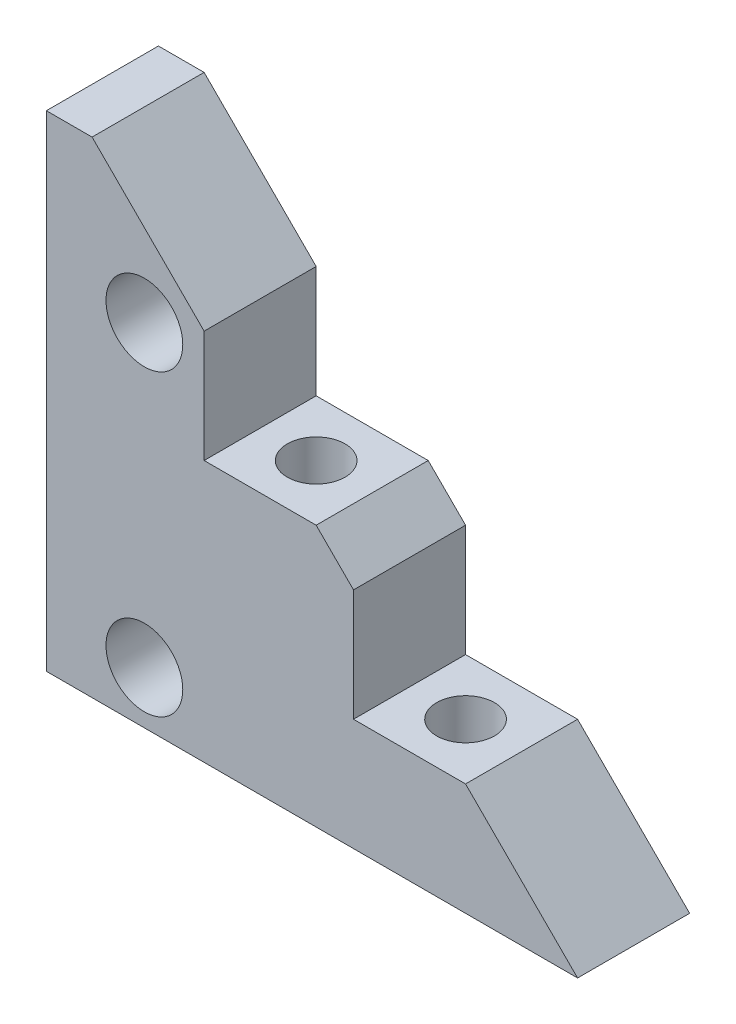
ISO-10303-21;
HEADER;
FILE_DESCRIPTION(('STEP AP214'),'2;1');
FILE_NAME('part.step','',(''),(''),'','','');
FILE_SCHEMA(('AUTOMOTIVE_DESIGN { 1 0 10303 214 1 1 1 1 }'));
ENDSEC;
DATA;
#1=APPLICATION_CONTEXT('core data for automotive mechanical design processes');
#2=APPLICATION_PROTOCOL_DEFINITION('international standard','automotive_design',2000,#1);
#3=PRODUCT_CONTEXT('',#1,'mechanical');
#4=PRODUCT('Part','Part','',(#3));
#5=PRODUCT_RELATED_PRODUCT_CATEGORY('part','',(#4));
#6=PRODUCT_DEFINITION_FORMATION('','',#4);
#7=PRODUCT_DEFINITION_CONTEXT('part definition',#1,'design');
#8=PRODUCT_DEFINITION('design','',#6,#7);
#9=PRODUCT_DEFINITION_SHAPE('','',#8);
#10=(LENGTH_UNIT() NAMED_UNIT(*) SI_UNIT(.MILLI.,.METRE.));
#11=(NAMED_UNIT(*) PLANE_ANGLE_UNIT() SI_UNIT($,.RADIAN.));
#12=(NAMED_UNIT(*) SI_UNIT($,.STERADIAN.) SOLID_ANGLE_UNIT());
#13=UNCERTAINTY_MEASURE_WITH_UNIT(LENGTH_MEASURE(1.E-05),#10,'distance_accuracy_value','');
#14=(GEOMETRIC_REPRESENTATION_CONTEXT(3) GLOBAL_UNCERTAINTY_ASSIGNED_CONTEXT((#13)) GLOBAL_UNIT_ASSIGNED_CONTEXT((#10,
#11,#12)) REPRESENTATION_CONTEXT('',''));
#15=CARTESIAN_POINT('',(0.,0.,0.));
#16=DIRECTION('',(0.,0.,1.));
#17=DIRECTION('',(1.,0.,0.));
#18=AXIS2_PLACEMENT_3D('',#15,#16,#17);
#19=CARTESIAN_POINT('',(0.,0.,9.525));
#20=DIRECTION('',(0.,1.,0.));
#21=DIRECTION('',(0.,0.,1.));
#22=AXIS2_PLACEMENT_3D('',#19,#20,#21);
#23=PLANE('',#22);
#24=CARTESIAN_POINT('',(14.2875,0.,4.7625));
#25=DIRECTION('',(0.,1.,0.));
#26=DIRECTION('',(0.,0.,1.));
#27=AXIS2_PLACEMENT_3D('',#24,#25,#26);
#28=CIRCLE('',#27,2.45744999999999);
#29=CARTESIAN_POINT('',(14.2875,0.,7.21994999999999));
#30=VERTEX_POINT('',#29);
#31=EDGE_CURVE('E224',#30,#30,#28,.T.);
#32=ORIENTED_EDGE('',*,*,#31,.T.);
#33=EDGE_LOOP('',(#32));
#34=FACE_BOUND('',#33,.T.);
#35=CARTESIAN_POINT('',(26.9875,0.,4.7625));
#36=DIRECTION('',(0.,1.,0.));
#37=DIRECTION('',(0.,0.,1.));
#38=AXIS2_PLACEMENT_3D('',#35,#36,#37);
#39=CIRCLE('',#38,2.45745);
#40=CARTESIAN_POINT('',(26.9875,0.,7.21995));
#41=VERTEX_POINT('',#40);
#42=EDGE_CURVE('E221',#41,#41,#39,.T.);
#43=ORIENTED_EDGE('',*,*,#42,.T.);
#44=EDGE_LOOP('',(#43));
#45=FACE_BOUND('',#44,.T.);
#46=DIRECTION('',(1.,0.,0.));
#47=VECTOR('',#46,1.);
#48=CARTESIAN_POINT('',(0.,0.,0.));
#49=LINE('',#48,#47);
#50=CARTESIAN_POINT('',(-3.8862,0.,0.));
#51=VERTEX_POINT('',#50);
#52=CARTESIAN_POINT('',(41.275,0.,0.));
#53=VERTEX_POINT('',#52);
#54=EDGE_CURVE('E135',#51,#53,#49,.T.);
#55=ORIENTED_EDGE('',*,*,#54,.T.);
#56=DIRECTION('',(0.,0.,-1.));
#57=VECTOR('',#56,1.);
#58=CARTESIAN_POINT('',(41.275,0.,9.525));
#59=LINE('',#58,#57);
#60=CARTESIAN_POINT('',(41.275,0.,9.525));
#61=VERTEX_POINT('',#60);
#62=EDGE_CURVE('E11',#61,#53,#59,.T.);
#63=ORIENTED_EDGE('',*,*,#62,.F.);
#64=DIRECTION('',(1.,0.,0.));
#65=VECTOR('',#64,1.);
#66=CARTESIAN_POINT('',(0.,0.,9.525));
#67=LINE('',#66,#65);
#68=CARTESIAN_POINT('',(-3.8862,0.,9.525));
#69=VERTEX_POINT('',#68);
#70=EDGE_CURVE('E99',#69,#61,#67,.T.);
#71=ORIENTED_EDGE('',*,*,#70,.F.);
#72=DIRECTION('',(0.,0.,-1.));
#73=VECTOR('',#72,1.);
#74=CARTESIAN_POINT('',(-3.8862,0.,50.9825466645097));
#75=LINE('',#74,#73);
#76=EDGE_CURVE('E201',#69,#51,#75,.T.);
#77=ORIENTED_EDGE('',*,*,#76,.T.);
#78=EDGE_LOOP('',(#55,#63,#71,#77));
#79=FACE_BOUND('',#78,.T.);
#80=ADVANCED_FACE('F41',(#34,#45,#79),#23,.F.);
#81=CARTESIAN_POINT('',(41.275,0.,9.525));
#82=DIRECTION('',(-0.707106781186547,-0.707106781186548,0.));
#83=DIRECTION('',(0.707106781186548,-0.707106781186547,0.));
#84=AXIS2_PLACEMENT_3D('',#81,#82,#83);
#85=PLANE('',#84);
#86=DIRECTION('',(-0.707106781186548,0.707106781186547,0.));
#87=VECTOR('',#86,1.);
#88=CARTESIAN_POINT('',(41.275,0.,0.));
#89=LINE('',#88,#87);
#90=CARTESIAN_POINT('',(31.75,9.52500000000001,0.));
#91=VERTEX_POINT('',#90);
#92=EDGE_CURVE('E137',#53,#91,#89,.T.);
#93=ORIENTED_EDGE('',*,*,#92,.T.);
#94=DIRECTION('',(0.,0.,-1.));
#95=VECTOR('',#94,1.);
#96=CARTESIAN_POINT('',(31.75,9.52500000000001,9.525));
#97=LINE('',#96,#95);
#98=CARTESIAN_POINT('',(31.75,9.52500000000001,9.525));
#99=VERTEX_POINT('',#98);
#100=EDGE_CURVE('E49',#99,#91,#97,.T.);
#101=ORIENTED_EDGE('',*,*,#100,.F.);
#102=DIRECTION('',(-0.707106781186548,0.707106781186547,0.));
#103=VECTOR('',#102,1.);
#104=CARTESIAN_POINT('',(41.275,0.,9.525));
#105=LINE('',#104,#103);
#106=EDGE_CURVE('E186',#61,#99,#105,.T.);
#107=ORIENTED_EDGE('',*,*,#106,.F.);
#108=ORIENTED_EDGE('',*,*,#62,.T.);
#109=EDGE_LOOP('',(#93,#101,#107,#108));
#110=FACE_BOUND('',#109,.T.);
#111=ADVANCED_FACE('F245',(#110),#85,.F.);
#112=CARTESIAN_POINT('',(22.225,9.52500000000001,9.525));
#113=DIRECTION('',(0.,-1.,0.));
#114=DIRECTION('',(1.,0.,0.));
#115=AXIS2_PLACEMENT_3D('',#112,#113,#114);
#116=PLANE('',#115);
#117=CARTESIAN_POINT('',(26.9875,9.52500000000001,4.7625));
#118=DIRECTION('',(0.,-1.,0.));
#119=DIRECTION('',(1.,0.,0.));
#120=AXIS2_PLACEMENT_3D('',#117,#118,#119);
#121=CIRCLE('',#120,2.45745);
#122=CARTESIAN_POINT('',(29.44495,9.52500000000001,4.7625));
#123=VERTEX_POINT('',#122);
#124=EDGE_CURVE('E216',#123,#123,#121,.T.);
#125=ORIENTED_EDGE('',*,*,#124,.T.);
#126=EDGE_LOOP('',(#125));
#127=FACE_BOUND('',#126,.T.);
#128=DIRECTION('',(-1.,0.,0.));
#129=VECTOR('',#128,1.);
#130=CARTESIAN_POINT('',(22.225,9.52500000000001,0.));
#131=LINE('',#130,#129);
#132=CARTESIAN_POINT('',(22.225,9.52500000000001,0.));
#133=VERTEX_POINT('',#132);
#134=EDGE_CURVE('E140',#91,#133,#131,.T.);
#135=ORIENTED_EDGE('',*,*,#134,.T.);
#136=DIRECTION('',(0.,0.,-1.));
#137=VECTOR('',#136,1.);
#138=CARTESIAN_POINT('',(22.225,9.52500000000001,9.525));
#139=LINE('',#138,#137);
#140=CARTESIAN_POINT('',(22.225,9.52500000000001,9.525));
#141=VERTEX_POINT('',#140);
#142=EDGE_CURVE('E158',#141,#133,#139,.T.);
#143=ORIENTED_EDGE('',*,*,#142,.F.);
#144=DIRECTION('',(-1.,0.,0.));
#145=VECTOR('',#144,1.);
#146=CARTESIAN_POINT('',(22.225,9.52500000000001,9.525));
#147=LINE('',#146,#145);
#148=EDGE_CURVE('E167',#99,#141,#147,.T.);
#149=ORIENTED_EDGE('',*,*,#148,.F.);
#150=ORIENTED_EDGE('',*,*,#100,.T.);
#151=EDGE_LOOP('',(#135,#143,#149,#150));
#152=FACE_BOUND('',#151,.T.);
#153=ADVANCED_FACE('F165',(#127,#152),#116,.F.);
#154=CARTESIAN_POINT('',(22.225,19.05,9.525));
#155=DIRECTION('',(-1.,0.,0.));
#156=DIRECTION('',(0.,-1.,0.));
#157=AXIS2_PLACEMENT_3D('',#154,#155,#156);
#158=PLANE('',#157);
#159=DIRECTION('',(0.,1.,0.));
#160=VECTOR('',#159,1.);
#161=CARTESIAN_POINT('',(22.225,19.05,0.));
#162=LINE('',#161,#160);
#163=CARTESIAN_POINT('',(22.225,19.05,0.));
#164=VERTEX_POINT('',#163);
#165=EDGE_CURVE('E142',#133,#164,#162,.T.);
#166=ORIENTED_EDGE('',*,*,#165,.T.);
#167=DIRECTION('',(0.,0.,-1.));
#168=VECTOR('',#167,1.);
#169=CARTESIAN_POINT('',(22.225,19.05,9.525));
#170=LINE('',#169,#168);
#171=CARTESIAN_POINT('',(22.225,19.05,9.525));
#172=VERTEX_POINT('',#171);
#173=EDGE_CURVE('E155',#172,#164,#170,.T.);
#174=ORIENTED_EDGE('',*,*,#173,.F.);
#175=DIRECTION('',(0.,1.,0.));
#176=VECTOR('',#175,1.);
#177=CARTESIAN_POINT('',(22.225,19.05,9.525));
#178=LINE('',#177,#176);
#179=EDGE_CURVE('E182',#141,#172,#178,.T.);
#180=ORIENTED_EDGE('',*,*,#179,.F.);
#181=ORIENTED_EDGE('',*,*,#142,.T.);
#182=EDGE_LOOP('',(#166,#174,#180,#181));
#183=FACE_BOUND('',#182,.T.);
#184=ADVANCED_FACE('F178',(#183),#158,.F.);
#185=CARTESIAN_POINT('',(22.225,19.05,9.525));
#186=DIRECTION('',(-0.707106781186547,-0.707106781186548,0.));
#187=DIRECTION('',(0.707106781186548,-0.707106781186547,0.));
#188=AXIS2_PLACEMENT_3D('',#185,#186,#187);
#189=PLANE('',#188);
#190=DIRECTION('',(-0.707106781186548,0.707106781186547,0.));
#191=VECTOR('',#190,1.);
#192=CARTESIAN_POINT('',(22.225,19.05,0.));
#193=LINE('',#192,#191);
#194=CARTESIAN_POINT('',(19.05,22.225,0.));
#195=VERTEX_POINT('',#194);
#196=EDGE_CURVE('E144',#164,#195,#193,.T.);
#197=ORIENTED_EDGE('',*,*,#196,.T.);
#198=DIRECTION('',(0.,0.,-1.));
#199=VECTOR('',#198,1.);
#200=CARTESIAN_POINT('',(19.05,22.225,9.525));
#201=LINE('',#200,#199);
#202=CARTESIAN_POINT('',(19.05,22.225,9.525));
#203=VERTEX_POINT('',#202);
#204=EDGE_CURVE('E126',#203,#195,#201,.T.);
#205=ORIENTED_EDGE('',*,*,#204,.F.);
#206=DIRECTION('',(-0.707106781186548,0.707106781186547,0.));
#207=VECTOR('',#206,1.);
#208=CARTESIAN_POINT('',(22.225,19.05,9.525));
#209=LINE('',#208,#207);
#210=EDGE_CURVE('E121',#172,#203,#209,.T.);
#211=ORIENTED_EDGE('',*,*,#210,.F.);
#212=ORIENTED_EDGE('',*,*,#173,.T.);
#213=EDGE_LOOP('',(#197,#205,#211,#212));
#214=FACE_BOUND('',#213,.T.);
#215=ADVANCED_FACE('F181',(#214),#189,.F.);
#216=CARTESIAN_POINT('',(9.525,22.225,9.525));
#217=DIRECTION('',(0.,-1.,0.));
#218=DIRECTION('',(0.,0.,-1.));
#219=AXIS2_PLACEMENT_3D('',#216,#217,#218);
#220=PLANE('',#219);
#221=CARTESIAN_POINT('',(14.2875,22.225,4.7625));
#222=DIRECTION('',(0.,1.,0.));
#223=DIRECTION('',(0.,0.,1.));
#224=AXIS2_PLACEMENT_3D('',#221,#222,#223);
#225=CIRCLE('',#224,2.45745);
#226=CARTESIAN_POINT('',(14.2875,22.225,7.21995));
#227=VERTEX_POINT('',#226);
#228=EDGE_CURVE('E227',#227,#227,#225,.T.);
#229=ORIENTED_EDGE('',*,*,#228,.F.);
#230=EDGE_LOOP('',(#229));
#231=FACE_BOUND('',#230,.T.);
#232=DIRECTION('',(-1.,0.,0.));
#233=VECTOR('',#232,1.);
#234=CARTESIAN_POINT('',(9.525,22.225,0.));
#235=LINE('',#234,#233);
#236=CARTESIAN_POINT('',(9.525,22.225,0.));
#237=VERTEX_POINT('',#236);
#238=EDGE_CURVE('E84',#195,#237,#235,.T.);
#239=ORIENTED_EDGE('',*,*,#238,.T.);
#240=DIRECTION('',(0.,0.,-1.));
#241=VECTOR('',#240,1.);
#242=CARTESIAN_POINT('',(9.525,22.225,9.525));
#243=LINE('',#242,#241);
#244=CARTESIAN_POINT('',(9.525,22.225,9.525));
#245=VERTEX_POINT('',#244);
#246=EDGE_CURVE('E124',#245,#237,#243,.T.);
#247=ORIENTED_EDGE('',*,*,#246,.F.);
#248=DIRECTION('',(-1.,0.,0.));
#249=VECTOR('',#248,1.);
#250=CARTESIAN_POINT('',(9.525,22.225,9.525));
#251=LINE('',#250,#249);
#252=EDGE_CURVE('E116',#203,#245,#251,.T.);
#253=ORIENTED_EDGE('',*,*,#252,.F.);
#254=ORIENTED_EDGE('',*,*,#204,.T.);
#255=EDGE_LOOP('',(#239,#247,#253,#254));
#256=FACE_BOUND('',#255,.T.);
#257=ADVANCED_FACE('F125',(#231,#256),#220,.F.);
#258=CARTESIAN_POINT('',(9.525,31.75,9.525));
#259=DIRECTION('',(-1.,0.,0.));
#260=DIRECTION('',(0.,0.,1.));
#261=AXIS2_PLACEMENT_3D('',#258,#259,#260);
#262=PLANE('',#261);
#263=DIRECTION('',(0.,1.,0.));
#264=VECTOR('',#263,1.);
#265=CARTESIAN_POINT('',(9.525,31.75,0.));
#266=LINE('',#265,#264);
#267=CARTESIAN_POINT('',(9.525,31.75,0.));
#268=VERTEX_POINT('',#267);
#269=EDGE_CURVE('E91',#237,#268,#266,.T.);
#270=ORIENTED_EDGE('',*,*,#269,.T.);
#271=DIRECTION('',(0.,0.,-1.));
#272=VECTOR('',#271,1.);
#273=CARTESIAN_POINT('',(9.525,31.75,9.525));
#274=LINE('',#273,#272);
#275=CARTESIAN_POINT('',(9.525,31.75,9.525));
#276=VERTEX_POINT('',#275);
#277=EDGE_CURVE('E127',#276,#268,#274,.T.);
#278=ORIENTED_EDGE('',*,*,#277,.F.);
#279=DIRECTION('',(0.,1.,0.));
#280=VECTOR('',#279,1.);
#281=CARTESIAN_POINT('',(9.525,31.75,9.525));
#282=LINE('',#281,#280);
#283=EDGE_CURVE('E119',#245,#276,#282,.T.);
#284=ORIENTED_EDGE('',*,*,#283,.F.);
#285=ORIENTED_EDGE('',*,*,#246,.T.);
#286=EDGE_LOOP('',(#270,#278,#284,#285));
#287=FACE_BOUND('',#286,.T.);
#288=ADVANCED_FACE('F129',(#287),#262,.F.);
#289=CARTESIAN_POINT('',(9.525,31.75,9.525));
#290=DIRECTION('',(-0.707106781186548,-0.707106781186548,0.));
#291=DIRECTION('',(0.707106781186548,-0.707106781186548,0.));
#292=AXIS2_PLACEMENT_3D('',#289,#290,#291);
#293=PLANE('',#292);
#294=DIRECTION('',(-0.707106781186548,0.707106781186548,0.));
#295=VECTOR('',#294,1.);
#296=CARTESIAN_POINT('',(9.525,31.75,0.));
#297=LINE('',#296,#295);
#298=CARTESIAN_POINT('',(0.,41.275,0.));
#299=VERTEX_POINT('',#298);
#300=EDGE_CURVE('E148',#268,#299,#297,.T.);
#301=ORIENTED_EDGE('',*,*,#300,.T.);
#302=DIRECTION('',(0.,0.,-1.));
#303=VECTOR('',#302,1.);
#304=CARTESIAN_POINT('',(0.,41.275,9.525));
#305=LINE('',#304,#303);
#306=CARTESIAN_POINT('',(0.,41.275,9.525));
#307=VERTEX_POINT('',#306);
#308=EDGE_CURVE('E131',#307,#299,#305,.T.);
#309=ORIENTED_EDGE('',*,*,#308,.F.);
#310=DIRECTION('',(-0.707106781186548,0.707106781186548,0.));
#311=VECTOR('',#310,1.);
#312=CARTESIAN_POINT('',(9.525,31.75,9.525));
#313=LINE('',#312,#311);
#314=EDGE_CURVE('E57',#276,#307,#313,.T.);
#315=ORIENTED_EDGE('',*,*,#314,.F.);
#316=ORIENTED_EDGE('',*,*,#277,.T.);
#317=EDGE_LOOP('',(#301,#309,#315,#316));
#318=FACE_BOUND('',#317,.T.);
#319=ADVANCED_FACE('F240',(#318),#293,.F.);
#320=CARTESIAN_POINT('',(0.,0.,9.525));
#321=DIRECTION('',(0.,0.,1.));
#322=DIRECTION('',(1.,0.,0.));
#323=AXIS2_PLACEMENT_3D('',#320,#321,#322);
#324=PLANE('',#323);
#325=CARTESIAN_POINT('',(4.44500000000001,29.845,9.525));
#326=DIRECTION('',(0.,0.,1.));
#327=DIRECTION('',(1.,0.,0.));
#328=AXIS2_PLACEMENT_3D('',#325,#326,#327);
#329=CIRCLE('',#328,3.2639);
#330=CARTESIAN_POINT('',(7.70890000000001,29.845,9.525));
#331=VERTEX_POINT('',#330);
#332=EDGE_CURVE('E196',#331,#331,#329,.T.);
#333=ORIENTED_EDGE('',*,*,#332,.F.);
#334=EDGE_LOOP('',(#333));
#335=FACE_BOUND('',#334,.T.);
#336=CARTESIAN_POINT('',(4.44500000000001,4.445,9.525));
#337=DIRECTION('',(0.,0.,1.));
#338=DIRECTION('',(1.,0.,0.));
#339=AXIS2_PLACEMENT_3D('',#336,#337,#338);
#340=CIRCLE('',#339,3.2639);
#341=CARTESIAN_POINT('',(7.70890000000001,4.445,9.525));
#342=VERTEX_POINT('',#341);
#343=EDGE_CURVE('E189',#342,#342,#340,.T.);
#344=ORIENTED_EDGE('',*,*,#343,.F.);
#345=EDGE_LOOP('',(#344));
#346=FACE_BOUND('',#345,.T.);
#347=ORIENTED_EDGE('',*,*,#314,.T.);
#348=DIRECTION('',(1.,0.,0.));
#349=VECTOR('',#348,1.);
#350=CARTESIAN_POINT('',(0.,41.275,9.525));
#351=LINE('',#350,#349);
#352=CARTESIAN_POINT('',(-3.8862,41.275,9.525));
#353=VERTEX_POINT('',#352);
#354=EDGE_CURVE('E193',#353,#307,#351,.T.);
#355=ORIENTED_EDGE('',*,*,#354,.F.);
#356=DIRECTION('',(0.,1.,0.));
#357=VECTOR('',#356,1.);
#358=CARTESIAN_POINT('',(-3.8862,41.275,9.525));
#359=LINE('',#358,#357);
#360=EDGE_CURVE('E204',#69,#353,#359,.T.);
#361=ORIENTED_EDGE('',*,*,#360,.F.);
#362=ORIENTED_EDGE('',*,*,#70,.T.);
#363=ORIENTED_EDGE('',*,*,#106,.T.);
#364=ORIENTED_EDGE('',*,*,#148,.T.);
#365=ORIENTED_EDGE('',*,*,#179,.T.);
#366=ORIENTED_EDGE('',*,*,#210,.T.);
#367=ORIENTED_EDGE('',*,*,#252,.T.);
#368=ORIENTED_EDGE('',*,*,#283,.T.);
#369=EDGE_LOOP('',(#347,#355,#361,#362,#363,#364,#365,#366,#367,#368));
#370=FACE_BOUND('',#369,.T.);
#371=ADVANCED_FACE('F117',(#335,#346,#370),#324,.T.);
#372=CARTESIAN_POINT('',(0.,0.,0.));
#373=DIRECTION('',(0.,0.,1.));
#374=DIRECTION('',(1.,0.,0.));
#375=AXIS2_PLACEMENT_3D('',#372,#373,#374);
#376=PLANE('',#375);
#377=CARTESIAN_POINT('',(4.44500000000001,29.845,0.));
#378=DIRECTION('',(0.,0.,1.));
#379=DIRECTION('',(1.,0.,0.));
#380=AXIS2_PLACEMENT_3D('',#377,#378,#379);
#381=CIRCLE('',#380,3.2639);
#382=CARTESIAN_POINT('',(7.70890000000001,29.845,0.));
#383=VERTEX_POINT('',#382);
#384=EDGE_CURVE('E138',#383,#383,#381,.T.);
#385=ORIENTED_EDGE('',*,*,#384,.T.);
#386=EDGE_LOOP('',(#385));
#387=FACE_BOUND('',#386,.T.);
#388=CARTESIAN_POINT('',(4.44500000000001,4.445,0.));
#389=DIRECTION('',(0.,0.,1.));
#390=DIRECTION('',(1.,0.,0.));
#391=AXIS2_PLACEMENT_3D('',#388,#389,#390);
#392=CIRCLE('',#391,3.2639);
#393=CARTESIAN_POINT('',(7.70890000000001,4.445,0.));
#394=VERTEX_POINT('',#393);
#395=EDGE_CURVE('E192',#394,#394,#392,.T.);
#396=ORIENTED_EDGE('',*,*,#395,.T.);
#397=EDGE_LOOP('',(#396));
#398=FACE_BOUND('',#397,.T.);
#399=ORIENTED_EDGE('',*,*,#54,.F.);
#400=DIRECTION('',(0.,1.,0.));
#401=VECTOR('',#400,1.);
#402=CARTESIAN_POINT('',(-3.8862,41.275,0.));
#403=LINE('',#402,#401);
#404=CARTESIAN_POINT('',(-3.8862,41.275,0.));
#405=VERTEX_POINT('',#404);
#406=EDGE_CURVE('E213',#51,#405,#403,.T.);
#407=ORIENTED_EDGE('',*,*,#406,.T.);
#408=DIRECTION('',(1.,0.,0.));
#409=VECTOR('',#408,1.);
#410=CARTESIAN_POINT('',(0.,41.275,0.));
#411=LINE('',#410,#409);
#412=EDGE_CURVE('E205',#405,#299,#411,.T.);
#413=ORIENTED_EDGE('',*,*,#412,.T.);
#414=ORIENTED_EDGE('',*,*,#300,.F.);
#415=ORIENTED_EDGE('',*,*,#269,.F.);
#416=ORIENTED_EDGE('',*,*,#238,.F.);
#417=ORIENTED_EDGE('',*,*,#196,.F.);
#418=ORIENTED_EDGE('',*,*,#165,.F.);
#419=ORIENTED_EDGE('',*,*,#134,.F.);
#420=ORIENTED_EDGE('',*,*,#92,.F.);
#421=EDGE_LOOP('',(#399,#407,#413,#414,#415,#416,#417,#418,#419,#420));
#422=FACE_BOUND('',#421,.T.);
#423=ADVANCED_FACE('F174',(#387,#398,#422),#376,.F.);
#424=CARTESIAN_POINT('',(4.44500000000001,4.445,0.));
#425=DIRECTION('',(0.,0.,1.));
#426=DIRECTION('',(1.,0.,0.));
#427=AXIS2_PLACEMENT_3D('',#424,#425,#426);
#428=CYLINDRICAL_SURFACE('',#427,3.2639);
#429=CARTESIAN_POINT('',(7.70890000000001,4.445,0.));
#430=CARTESIAN_POINT('',(7.70890000000001,4.445,0.0992187499999999));
#431=CARTESIAN_POINT('',(7.70890000000001,4.445,0.1984375));
#432=CARTESIAN_POINT('',(7.70890000000001,4.445,0.396875));
#433=CARTESIAN_POINT('',(7.70890000000001,4.445,0.49609375));
#434=CARTESIAN_POINT('',(7.70890000000001,4.445,0.69453125));
#435=CARTESIAN_POINT('',(7.70890000000001,4.445,0.79375));
#436=CARTESIAN_POINT('',(7.70890000000001,4.445,0.9921875));
#437=CARTESIAN_POINT('',(7.70890000000001,4.445,1.09140625));
#438=CARTESIAN_POINT('',(7.70890000000001,4.445,1.28984375));
#439=CARTESIAN_POINT('',(7.70890000000001,4.445,1.3890625));
#440=CARTESIAN_POINT('',(7.70890000000001,4.445,1.5875));
#441=CARTESIAN_POINT('',(7.70890000000001,4.445,1.68671875));
#442=CARTESIAN_POINT('',(7.70890000000001,4.445,1.88515625));
#443=CARTESIAN_POINT('',(7.70890000000001,4.445,1.984375));
#444=CARTESIAN_POINT('',(7.70890000000001,4.445,2.1828125));
#445=CARTESIAN_POINT('',(7.70890000000001,4.445,2.28203125));
#446=CARTESIAN_POINT('',(7.70890000000001,4.445,2.48046875));
#447=CARTESIAN_POINT('',(7.70890000000001,4.445,2.5796875));
#448=CARTESIAN_POINT('',(7.70890000000001,4.445,2.778125));
#449=CARTESIAN_POINT('',(7.70890000000001,4.445,2.87734375));
#450=CARTESIAN_POINT('',(7.70890000000001,4.445,3.07578125));
#451=CARTESIAN_POINT('',(7.70890000000001,4.445,3.175));
#452=CARTESIAN_POINT('',(7.70890000000001,4.445,3.3734375));
#453=CARTESIAN_POINT('',(7.70890000000001,4.445,3.47265625));
#454=CARTESIAN_POINT('',(7.70890000000001,4.445,3.67109375));
#455=CARTESIAN_POINT('',(7.70890000000001,4.445,3.7703125));
#456=CARTESIAN_POINT('',(7.70890000000001,4.445,3.96875));
#457=CARTESIAN_POINT('',(7.70890000000001,4.445,4.06796875));
#458=CARTESIAN_POINT('',(7.70890000000001,4.445,4.26640625));
#459=CARTESIAN_POINT('',(7.70890000000001,4.445,4.365625));
#460=CARTESIAN_POINT('',(7.70890000000001,4.445,4.5640625));
#461=CARTESIAN_POINT('',(7.70890000000001,4.445,4.66328125));
#462=CARTESIAN_POINT('',(7.70890000000001,4.445,4.86171875));
#463=CARTESIAN_POINT('',(7.70890000000001,4.445,4.9609375));
#464=CARTESIAN_POINT('',(7.70890000000001,4.445,5.159375));
#465=CARTESIAN_POINT('',(7.70890000000001,4.445,5.25859375));
#466=CARTESIAN_POINT('',(7.70890000000001,4.445,5.45703125));
#467=CARTESIAN_POINT('',(7.70890000000001,4.445,5.55625));
#468=CARTESIAN_POINT('',(7.70890000000001,4.445,5.7546875));
#469=CARTESIAN_POINT('',(7.70890000000001,4.445,5.85390625));
#470=CARTESIAN_POINT('',(7.70890000000001,4.445,6.05234375));
#471=CARTESIAN_POINT('',(7.70890000000001,4.445,6.1515625));
#472=CARTESIAN_POINT('',(7.70890000000001,4.445,6.35));
#473=CARTESIAN_POINT('',(7.70890000000001,4.445,6.44921875));
#474=CARTESIAN_POINT('',(7.70890000000001,4.445,6.64765625));
#475=CARTESIAN_POINT('',(7.70890000000001,4.445,6.746875));
#476=CARTESIAN_POINT('',(7.70890000000001,4.445,6.9453125));
#477=CARTESIAN_POINT('',(7.70890000000001,4.445,7.04453125));
#478=CARTESIAN_POINT('',(7.70890000000001,4.445,7.24296875));
#479=CARTESIAN_POINT('',(7.70890000000001,4.445,7.3421875));
#480=CARTESIAN_POINT('',(7.70890000000001,4.445,7.540625));
#481=CARTESIAN_POINT('',(7.70890000000001,4.445,7.63984375));
#482=CARTESIAN_POINT('',(7.70890000000001,4.445,7.83828125));
#483=CARTESIAN_POINT('',(7.70890000000001,4.445,7.9375));
#484=CARTESIAN_POINT('',(7.70890000000001,4.445,8.1359375));
#485=CARTESIAN_POINT('',(7.70890000000001,4.445,8.23515625));
#486=CARTESIAN_POINT('',(7.70890000000001,4.445,8.43359375));
#487=CARTESIAN_POINT('',(7.70890000000001,4.445,8.5328125));
#488=CARTESIAN_POINT('',(7.70890000000001,4.445,8.73125));
#489=CARTESIAN_POINT('',(7.70890000000001,4.445,8.83046875));
#490=CARTESIAN_POINT('',(7.70890000000001,4.445,9.02890625));
#491=CARTESIAN_POINT('',(7.70890000000001,4.445,9.128125));
#492=CARTESIAN_POINT('',(7.70890000000001,4.445,9.3265625));
#493=CARTESIAN_POINT('',(7.70890000000001,4.445,9.42578125));
#494=CARTESIAN_POINT('',(7.70890000000001,4.445,9.525));
#495=B_SPLINE_CURVE_WITH_KNOTS('',3,(#429,#430,#431,#432,#433,#434,#435,#436,#437,#438,#439,
#440,#441,#442,#443,#444,#445,#446,#447,#448,#449,#450,#451,#452,#453,#454,#455,#456,#457,#458,
#459,#460,#461,#462,#463,#464,#465,#466,#467,#468,#469,#470,#471,#472,#473,#474,#475,#476,#477,
#478,#479,#480,#481,#482,#483,#484,#485,#486,#487,#488,#489,#490,#491,#492,#493,#494),
.UNSPECIFIED.,.F.,.F.,(4,2,2,2,2,2,2,2,2,2,2,2,2,2,2,2,2,2,2,2,2,2,2,2,2,2,2,2,2,2,2,2,4),(0.,
0.29765625,0.5953125,0.89296875,1.190625,1.48828125,1.7859375,2.08359375,2.38125,2.67890625,
2.9765625,3.27421875,3.571875,3.86953125,4.1671875,4.46484375,4.7625,5.06015625,5.3578125,
5.65546875,5.953125,6.25078125,6.5484375,6.84609375,7.14375,7.44140625,7.7390625,8.03671875,
8.334375,8.63203125,8.9296875,9.22734375,9.525),.UNSPECIFIED.);
#496=EDGE_CURVE('BSEAM281',#394,#342,#495,.T.);
#497=ORIENTED_EDGE('',*,*,#395,.F.);
#498=ORIENTED_EDGE('',*,*,#343,.T.);
#499=ORIENTED_EDGE('',*,*,#496,.T.);
#500=ORIENTED_EDGE('',*,*,#496,.F.);
#501=EDGE_LOOP('',(#497,#499,#498,#500));
#502=FACE_BOUND('',#501,.T.);
#503=ADVANCED_FACE('F281',(#502),#428,.F.);
#504=CARTESIAN_POINT('',(4.44500000000001,29.845,0.));
#505=DIRECTION('',(0.,0.,1.));
#506=DIRECTION('',(1.,0.,0.));
#507=AXIS2_PLACEMENT_3D('',#504,#505,#506);
#508=CYLINDRICAL_SURFACE('',#507,3.2639);
#509=CARTESIAN_POINT('',(7.70890000000001,29.845,0.));
#510=CARTESIAN_POINT('',(7.70890000000001,29.845,0.0992187499999999));
#511=CARTESIAN_POINT('',(7.70890000000001,29.845,0.1984375));
#512=CARTESIAN_POINT('',(7.70890000000001,29.845,0.396875));
#513=CARTESIAN_POINT('',(7.70890000000001,29.845,0.49609375));
#514=CARTESIAN_POINT('',(7.70890000000001,29.845,0.69453125));
#515=CARTESIAN_POINT('',(7.70890000000001,29.845,0.79375));
#516=CARTESIAN_POINT('',(7.70890000000001,29.845,0.9921875));
#517=CARTESIAN_POINT('',(7.70890000000001,29.845,1.09140625));
#518=CARTESIAN_POINT('',(7.70890000000001,29.845,1.28984375));
#519=CARTESIAN_POINT('',(7.70890000000001,29.845,1.3890625));
#520=CARTESIAN_POINT('',(7.70890000000001,29.845,1.5875));
#521=CARTESIAN_POINT('',(7.70890000000001,29.845,1.68671875));
#522=CARTESIAN_POINT('',(7.70890000000001,29.845,1.88515625));
#523=CARTESIAN_POINT('',(7.70890000000001,29.845,1.984375));
#524=CARTESIAN_POINT('',(7.70890000000001,29.845,2.1828125));
#525=CARTESIAN_POINT('',(7.70890000000001,29.845,2.28203125));
#526=CARTESIAN_POINT('',(7.70890000000001,29.845,2.48046875));
#527=CARTESIAN_POINT('',(7.70890000000001,29.845,2.5796875));
#528=CARTESIAN_POINT('',(7.70890000000001,29.845,2.778125));
#529=CARTESIAN_POINT('',(7.70890000000001,29.845,2.87734375));
#530=CARTESIAN_POINT('',(7.70890000000001,29.845,3.07578125));
#531=CARTESIAN_POINT('',(7.70890000000001,29.845,3.175));
#532=CARTESIAN_POINT('',(7.70890000000001,29.845,3.3734375));
#533=CARTESIAN_POINT('',(7.70890000000001,29.845,3.47265625));
#534=CARTESIAN_POINT('',(7.70890000000001,29.845,3.67109375));
#535=CARTESIAN_POINT('',(7.70890000000001,29.845,3.7703125));
#536=CARTESIAN_POINT('',(7.70890000000001,29.845,3.96875));
#537=CARTESIAN_POINT('',(7.70890000000001,29.845,4.06796875));
#538=CARTESIAN_POINT('',(7.70890000000001,29.845,4.26640625));
#539=CARTESIAN_POINT('',(7.70890000000001,29.845,4.365625));
#540=CARTESIAN_POINT('',(7.70890000000001,29.845,4.5640625));
#541=CARTESIAN_POINT('',(7.70890000000001,29.845,4.66328125));
#542=CARTESIAN_POINT('',(7.70890000000001,29.845,4.86171875));
#543=CARTESIAN_POINT('',(7.70890000000001,29.845,4.9609375));
#544=CARTESIAN_POINT('',(7.70890000000001,29.845,5.159375));
#545=CARTESIAN_POINT('',(7.70890000000001,29.845,5.25859375));
#546=CARTESIAN_POINT('',(7.70890000000001,29.845,5.45703125));
#547=CARTESIAN_POINT('',(7.70890000000001,29.845,5.55625));
#548=CARTESIAN_POINT('',(7.70890000000001,29.845,5.7546875));
#549=CARTESIAN_POINT('',(7.70890000000001,29.845,5.85390625));
#550=CARTESIAN_POINT('',(7.70890000000001,29.845,6.05234375));
#551=CARTESIAN_POINT('',(7.70890000000001,29.845,6.1515625));
#552=CARTESIAN_POINT('',(7.70890000000001,29.845,6.35));
#553=CARTESIAN_POINT('',(7.70890000000001,29.845,6.44921875));
#554=CARTESIAN_POINT('',(7.70890000000001,29.845,6.64765625));
#555=CARTESIAN_POINT('',(7.70890000000001,29.845,6.746875));
#556=CARTESIAN_POINT('',(7.70890000000001,29.845,6.9453125));
#557=CARTESIAN_POINT('',(7.70890000000001,29.845,7.04453125));
#558=CARTESIAN_POINT('',(7.70890000000001,29.845,7.24296875));
#559=CARTESIAN_POINT('',(7.70890000000001,29.845,7.3421875));
#560=CARTESIAN_POINT('',(7.70890000000001,29.845,7.540625));
#561=CARTESIAN_POINT('',(7.70890000000001,29.845,7.63984375));
#562=CARTESIAN_POINT('',(7.70890000000001,29.845,7.83828125));
#563=CARTESIAN_POINT('',(7.70890000000001,29.845,7.9375));
#564=CARTESIAN_POINT('',(7.70890000000001,29.845,8.1359375));
#565=CARTESIAN_POINT('',(7.70890000000001,29.845,8.23515625));
#566=CARTESIAN_POINT('',(7.70890000000001,29.845,8.43359375));
#567=CARTESIAN_POINT('',(7.70890000000001,29.845,8.5328125));
#568=CARTESIAN_POINT('',(7.70890000000001,29.845,8.73125));
#569=CARTESIAN_POINT('',(7.70890000000001,29.845,8.83046875));
#570=CARTESIAN_POINT('',(7.70890000000001,29.845,9.02890625));
#571=CARTESIAN_POINT('',(7.70890000000001,29.845,9.128125));
#572=CARTESIAN_POINT('',(7.70890000000001,29.845,9.3265625));
#573=CARTESIAN_POINT('',(7.70890000000001,29.845,9.42578125));
#574=CARTESIAN_POINT('',(7.70890000000001,29.845,9.525));
#575=B_SPLINE_CURVE_WITH_KNOTS('',3,(#509,#510,#511,#512,#513,#514,#515,#516,#517,#518,#519,
#520,#521,#522,#523,#524,#525,#526,#527,#528,#529,#530,#531,#532,#533,#534,#535,#536,#537,#538,
#539,#540,#541,#542,#543,#544,#545,#546,#547,#548,#549,#550,#551,#552,#553,#554,#555,#556,#557,
#558,#559,#560,#561,#562,#563,#564,#565,#566,#567,#568,#569,#570,#571,#572,#573,#574),
.UNSPECIFIED.,.F.,.F.,(4,2,2,2,2,2,2,2,2,2,2,2,2,2,2,2,2,2,2,2,2,2,2,2,2,2,2,2,2,2,2,2,4),(0.,
0.29765625,0.5953125,0.89296875,1.190625,1.48828125,1.7859375,2.08359375,2.38125,2.67890625,
2.9765625,3.27421875,3.571875,3.86953125,4.1671875,4.46484375,4.7625,5.06015625,5.3578125,
5.65546875,5.953125,6.25078125,6.5484375,6.84609375,7.14375,7.44140625,7.7390625,8.03671875,
8.334375,8.63203125,8.9296875,9.22734375,9.525),.UNSPECIFIED.);
#576=EDGE_CURVE('BSEAM273',#383,#331,#575,.T.);
#577=ORIENTED_EDGE('',*,*,#384,.F.);
#578=ORIENTED_EDGE('',*,*,#332,.T.);
#579=ORIENTED_EDGE('',*,*,#576,.T.);
#580=ORIENTED_EDGE('',*,*,#576,.F.);
#581=EDGE_LOOP('',(#577,#579,#578,#580));
#582=FACE_BOUND('',#581,.T.);
#583=ADVANCED_FACE('F273',(#582),#508,.F.);
#584=CARTESIAN_POINT('',(-3.8862,41.275,50.9825466645097));
#585=DIRECTION('',(-1.,0.,0.));
#586=DIRECTION('',(0.,-1.,0.));
#587=AXIS2_PLACEMENT_3D('',#584,#585,#586);
#588=PLANE('',#587);
#589=ORIENTED_EDGE('',*,*,#76,.F.);
#590=ORIENTED_EDGE('',*,*,#360,.T.);
#591=DIRECTION('',(0.,0.,-1.));
#592=VECTOR('',#591,1.);
#593=CARTESIAN_POINT('',(-3.8862,41.275,50.9825466645097));
#594=LINE('',#593,#592);
#595=EDGE_CURVE('E206',#353,#405,#594,.T.);
#596=ORIENTED_EDGE('',*,*,#595,.T.);
#597=ORIENTED_EDGE('',*,*,#406,.F.);
#598=EDGE_LOOP('',(#589,#590,#596,#597));
#599=FACE_BOUND('',#598,.T.);
#600=ADVANCED_FACE('F271',(#599),#588,.T.);
#601=CARTESIAN_POINT('',(0.,41.275,50.9825466645097));
#602=DIRECTION('',(0.,1.,0.));
#603=DIRECTION('',(0.,0.,1.));
#604=AXIS2_PLACEMENT_3D('',#601,#602,#603);
#605=PLANE('',#604);
#606=ORIENTED_EDGE('',*,*,#595,.F.);
#607=ORIENTED_EDGE('',*,*,#354,.T.);
#608=ORIENTED_EDGE('',*,*,#308,.T.);
#609=ORIENTED_EDGE('',*,*,#412,.F.);
#610=EDGE_LOOP('',(#606,#607,#608,#609));
#611=FACE_BOUND('',#610,.T.);
#612=ADVANCED_FACE('F269',(#611),#605,.T.);
#613=CARTESIAN_POINT('',(26.9875,22.225,4.7625));
#614=DIRECTION('',(0.,1.,0.));
#615=DIRECTION('',(0.,0.,1.));
#616=AXIS2_PLACEMENT_3D('',#613,#614,#615);
#617=CYLINDRICAL_SURFACE('',#616,2.45745);
#618=ORIENTED_EDGE('',*,*,#42,.F.);
#619=EDGE_LOOP('',(#618));
#620=FACE_BOUND('',#619,.T.);
#621=ORIENTED_EDGE('',*,*,#124,.F.);
#622=EDGE_LOOP('',(#621));
#623=FACE_BOUND('',#622,.T.);
#624=ADVANCED_FACE('F279',(#620,#623),#617,.F.);
#625=CARTESIAN_POINT('',(14.2875,22.225,4.7625));
#626=DIRECTION('',(0.,1.,0.));
#627=DIRECTION('',(0.,0.,1.));
#628=AXIS2_PLACEMENT_3D('',#625,#626,#627);
#629=CYLINDRICAL_SURFACE('',#628,2.45744999999999);
#630=ORIENTED_EDGE('',*,*,#31,.F.);
#631=EDGE_LOOP('',(#630));
#632=FACE_BOUND('',#631,.T.);
#633=ORIENTED_EDGE('',*,*,#228,.T.);
#634=EDGE_LOOP('',(#633));
#635=FACE_BOUND('',#634,.T.);
#636=ADVANCED_FACE('F231',(#632,#635),#629,.F.);
#637=CLOSED_SHELL('',(#80,#111,#153,#184,#215,#257,#288,#319,#371,#423,#503,#583,#600,#612,#624,#636));
#638=MANIFOLD_SOLID_BREP('B2',#637);
#639=ADVANCED_BREP_SHAPE_REPRESENTATION('',(#18,#638),#14);
#640=SHAPE_DEFINITION_REPRESENTATION(#9,#639);
ENDSEC;
END-ISO-10303-21;
